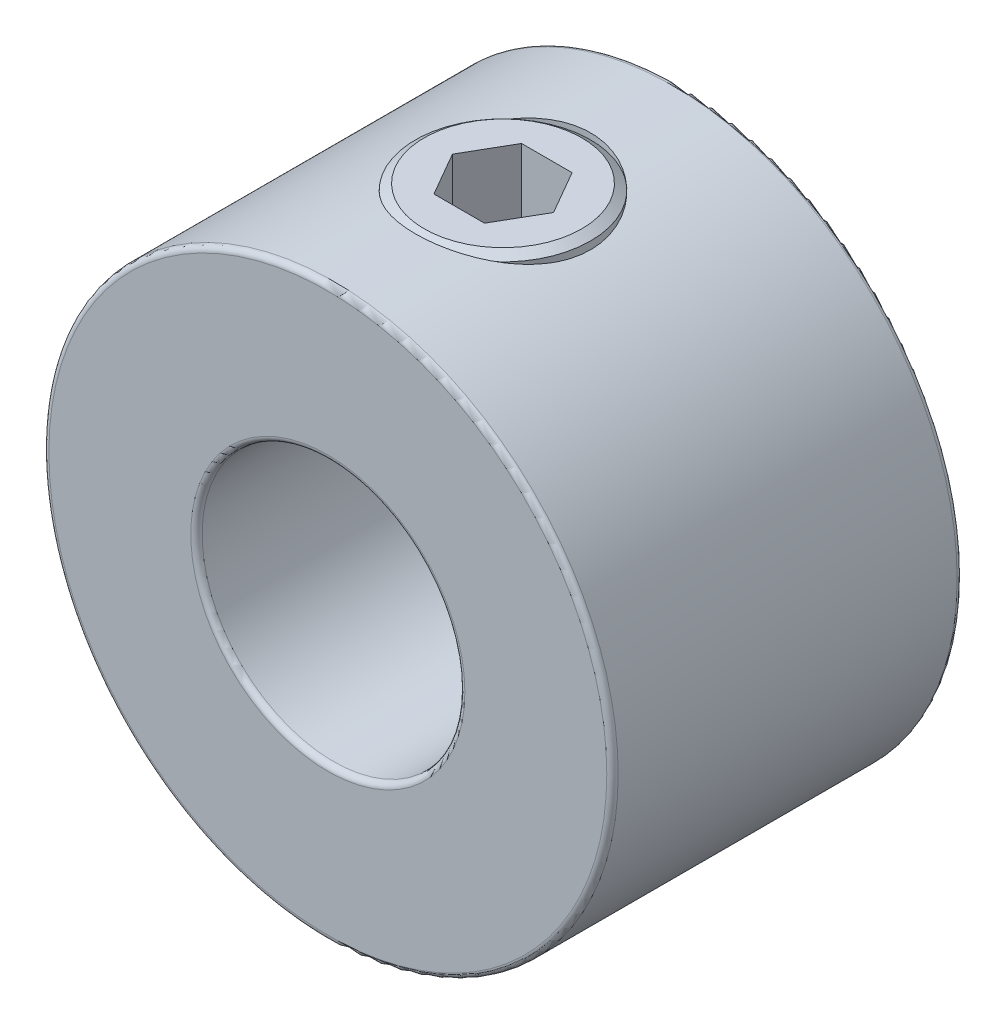
ISO-10303-21;
HEADER;
FILE_DESCRIPTION(('STEP AP214'),'2;1');
FILE_NAME('part.step','',(''),(''),'','','');
FILE_SCHEMA(('AUTOMOTIVE_DESIGN { 1 0 10303 214 1 1 1 1 }'));
ENDSEC;
DATA;
#1=APPLICATION_CONTEXT('core data for automotive mechanical design processes');
#2=APPLICATION_PROTOCOL_DEFINITION('international standard','automotive_design',2000,#1);
#3=PRODUCT_CONTEXT('',#1,'mechanical');
#4=PRODUCT('Part','Part','',(#3));
#5=PRODUCT_RELATED_PRODUCT_CATEGORY('part','',(#4));
#6=PRODUCT_DEFINITION_FORMATION('','',#4);
#7=PRODUCT_DEFINITION_CONTEXT('part definition',#1,'design');
#8=PRODUCT_DEFINITION('design','',#6,#7);
#9=PRODUCT_DEFINITION_SHAPE('','',#8);
#10=(LENGTH_UNIT() NAMED_UNIT(*) SI_UNIT(.MILLI.,.METRE.));
#11=(NAMED_UNIT(*) PLANE_ANGLE_UNIT() SI_UNIT($,.RADIAN.));
#12=(NAMED_UNIT(*) SI_UNIT($,.STERADIAN.) SOLID_ANGLE_UNIT());
#13=UNCERTAINTY_MEASURE_WITH_UNIT(LENGTH_MEASURE(1.E-05),#10,'distance_accuracy_value','');
#14=(GEOMETRIC_REPRESENTATION_CONTEXT(3) GLOBAL_UNCERTAINTY_ASSIGNED_CONTEXT((#13)) GLOBAL_UNIT_ASSIGNED_CONTEXT((#10,
#11,#12)) REPRESENTATION_CONTEXT('',''));
#15=CARTESIAN_POINT('',(0.,0.,0.));
#16=DIRECTION('',(0.,0.,1.));
#17=DIRECTION('',(1.,0.,0.));
#18=AXIS2_PLACEMENT_3D('',#15,#16,#17);
#19=CARTESIAN_POINT('',(0.,3.40407018740962,4.));
#20=DIRECTION('',(0.,1.,0.));
#21=DIRECTION('',(-1.,0.,0.));
#22=AXIS2_PLACEMENT_3D('',#19,#20,#21);
#23=CONICAL_SURFACE('',#22,2.,0.785398163397449);
#24=CARTESIAN_POINT('',(0.,2.5,4.));
#25=DIRECTION('',(0.,-1.,0.));
#26=DIRECTION('',(1.,0.,0.));
#27=AXIS2_PLACEMENT_3D('',#24,#25,#26);
#28=CIRCLE('',#27,1.09592981259038);
#29=CARTESIAN_POINT('',(1.09592981259038,2.5,4.));
#30=VERTEX_POINT('',#29);
#31=EDGE_CURVE('E12',#30,#30,#28,.T.);
#32=ORIENTED_EDGE('',*,*,#31,.F.);
#33=EDGE_LOOP('',(#32));
#34=FACE_BOUND('',#33,.T.);
#35=CARTESIAN_POINT('',(0.,3.40407018740962,4.));
#36=DIRECTION('',(0.,-1.,0.));
#37=DIRECTION('',(1.,0.,0.));
#38=AXIS2_PLACEMENT_3D('',#35,#36,#37);
#39=CIRCLE('',#38,2.);
#40=CARTESIAN_POINT('',(2.,3.40407018740962,4.));
#41=VERTEX_POINT('',#40);
#42=EDGE_CURVE('E145',#41,#41,#39,.T.);
#43=ORIENTED_EDGE('',*,*,#42,.T.);
#44=EDGE_LOOP('',(#43));
#45=FACE_BOUND('',#44,.T.);
#46=ADVANCED_FACE('F46',(#34,#45),#23,.T.);
#47=CARTESIAN_POINT('',(0.,2.5,4.));
#48=DIRECTION('',(0.,-1.,0.));
#49=DIRECTION('',(1.,0.,0.));
#50=AXIS2_PLACEMENT_3D('',#47,#48,#49);
#51=CONICAL_SURFACE('',#50,1.09592981259038,1.02974425867666);
#52=CARTESIAN_POINT('',(0.,3.15850106560381,4.));
#53=VERTEX_POINT('',#52);
#54=VERTEX_LOOP('',#53);
#55=FACE_BOUND('',#54,.T.);
#56=ORIENTED_EDGE('',*,*,#31,.T.);
#57=EDGE_LOOP('',(#56));
#58=FACE_BOUND('',#57,.T.);
#59=ADVANCED_FACE('F164',(#55,#58),#51,.F.);
#60=CARTESIAN_POINT('',(0.,6.5,4.));
#61=DIRECTION('',(0.,-1.,0.));
#62=DIRECTION('',(1.,0.,0.));
#63=AXIS2_PLACEMENT_3D('',#60,#61,#62);
#64=PLANE('',#63);
#65=DIRECTION('',(0.5,0.,0.866025403784439));
#66=VECTOR('',#65,1.);
#67=CARTESIAN_POINT('',(-1.15470053837925,6.5,4.));
#68=LINE('',#67,#66);
#69=CARTESIAN_POINT('',(-1.15470053837925,6.5,4.));
#70=VERTEX_POINT('',#69);
#71=CARTESIAN_POINT('',(-0.577350269189626,6.5,5.));
#72=VERTEX_POINT('',#71);
#73=EDGE_CURVE('E133',#70,#72,#68,.T.);
#74=ORIENTED_EDGE('',*,*,#73,.F.);
#75=DIRECTION('',(-0.5,0.,0.866025403784439));
#76=VECTOR('',#75,1.);
#77=CARTESIAN_POINT('',(-0.577350269189629,6.5,3.));
#78=LINE('',#77,#76);
#79=CARTESIAN_POINT('',(-0.577350269189629,6.5,3.));
#80=VERTEX_POINT('',#79);
#81=EDGE_CURVE('E60',#80,#70,#78,.T.);
#82=ORIENTED_EDGE('',*,*,#81,.F.);
#83=DIRECTION('',(-1.,0.,0.));
#84=VECTOR('',#83,1.);
#85=CARTESIAN_POINT('',(0.577350269189625,6.5,3.));
#86=LINE('',#85,#84);
#87=CARTESIAN_POINT('',(0.577350269189625,6.5,3.));
#88=VERTEX_POINT('',#87);
#89=EDGE_CURVE('E119',#88,#80,#86,.T.);
#90=ORIENTED_EDGE('',*,*,#89,.F.);
#91=DIRECTION('',(-0.5,0.,-0.866025403784439));
#92=VECTOR('',#91,1.);
#93=CARTESIAN_POINT('',(1.15470053837925,6.5,4.));
#94=LINE('',#93,#92);
#95=CARTESIAN_POINT('',(1.15470053837925,6.5,4.));
#96=VERTEX_POINT('',#95);
#97=EDGE_CURVE('E122',#96,#88,#94,.T.);
#98=ORIENTED_EDGE('',*,*,#97,.F.);
#99=DIRECTION('',(0.5,0.,-0.866025403784439));
#100=VECTOR('',#99,1.);
#101=CARTESIAN_POINT('',(0.577350269189623,6.5,5.));
#102=LINE('',#101,#100);
#103=CARTESIAN_POINT('',(0.577350269189623,6.5,5.));
#104=VERTEX_POINT('',#103);
#105=EDGE_CURVE('E138',#104,#96,#102,.T.);
#106=ORIENTED_EDGE('',*,*,#105,.F.);
#107=DIRECTION('',(1.,0.,0.));
#108=VECTOR('',#107,1.);
#109=CARTESIAN_POINT('',(-0.577350269189626,6.5,5.));
#110=LINE('',#109,#108);
#111=EDGE_CURVE('E135',#72,#104,#110,.T.);
#112=ORIENTED_EDGE('',*,*,#111,.F.);
#113=EDGE_LOOP('',(#74,#82,#90,#98,#106,#112));
#114=FACE_BOUND('',#113,.T.);
#115=CARTESIAN_POINT('',(0.,6.5,4.));
#116=DIRECTION('',(0.,-1.,0.));
#117=DIRECTION('',(1.,0.,0.));
#118=AXIS2_PLACEMENT_3D('',#115,#116,#117);
#119=CIRCLE('',#118,1.8);
#120=CARTESIAN_POINT('',(1.8,6.5,4.));
#121=VERTEX_POINT('',#120);
#122=EDGE_CURVE('E53',#121,#121,#119,.T.);
#123=ORIENTED_EDGE('',*,*,#122,.F.);
#124=EDGE_LOOP('',(#123));
#125=FACE_BOUND('',#124,.T.);
#126=ADVANCED_FACE('F162',(#114,#125),#64,.F.);
#127=CARTESIAN_POINT('',(0.,6.5,4.));
#128=DIRECTION('',(0.,-1.,0.));
#129=DIRECTION('',(1.,0.,0.));
#130=AXIS2_PLACEMENT_3D('',#127,#128,#129);
#131=CONICAL_SURFACE('',#130,1.8,0.959931088596886);
#132=CARTESIAN_POINT('',(0.,6.35995849235806,4.));
#133=DIRECTION('',(0.,-1.,0.));
#134=DIRECTION('',(1.,0.,0.));
#135=AXIS2_PLACEMENT_3D('',#132,#133,#134);
#136=CIRCLE('',#135,2.);
#137=CARTESIAN_POINT('',(2.,6.35995849235806,4.));
#138=VERTEX_POINT('',#137);
#139=EDGE_CURVE('E155',#138,#138,#136,.T.);
#140=ORIENTED_EDGE('',*,*,#139,.F.);
#141=EDGE_LOOP('',(#140));
#142=FACE_BOUND('',#141,.T.);
#143=ORIENTED_EDGE('',*,*,#122,.T.);
#144=EDGE_LOOP('',(#143));
#145=FACE_BOUND('',#144,.T.);
#146=ADVANCED_FACE('F160',(#142,#145),#131,.T.);
#147=CARTESIAN_POINT('',(0.,3.15850106560381,4.));
#148=DIRECTION('',(0.,-1.,0.));
#149=DIRECTION('',(1.,0.,0.));
#150=AXIS2_PLACEMENT_3D('',#147,#148,#149);
#151=CYLINDRICAL_SURFACE('',#150,2.);
#152=ORIENTED_EDGE('',*,*,#42,.F.);
#153=EDGE_LOOP('',(#152));
#154=FACE_BOUND('',#153,.T.);
#155=ORIENTED_EDGE('',*,*,#139,.T.);
#156=EDGE_LOOP('',(#155));
#157=FACE_BOUND('',#156,.T.);
#158=ADVANCED_FACE('F171',(#154,#157),#151,.T.);
#159=CARTESIAN_POINT('',(-0.577350269189629,4.9,3.));
#160=DIRECTION('',(-0.866025403784439,0.,-0.5));
#161=DIRECTION('',(-0.5,0.,0.866025403784439));
#162=AXIS2_PLACEMENT_3D('',#159,#160,#161);
#163=PLANE('',#162);
#164=ORIENTED_EDGE('',*,*,#81,.T.);
#165=DIRECTION('',(0.,1.,0.));
#166=VECTOR('',#165,1.);
#167=CARTESIAN_POINT('',(-1.15470053837925,4.9,4.));
#168=LINE('',#167,#166);
#169=CARTESIAN_POINT('',(-1.15470053837925,4.9,4.));
#170=VERTEX_POINT('',#169);
#171=EDGE_CURVE('E96',#170,#70,#168,.T.);
#172=ORIENTED_EDGE('',*,*,#171,.F.);
#173=DIRECTION('',(-0.5,0.,0.866025403784439));
#174=VECTOR('',#173,1.);
#175=CARTESIAN_POINT('',(-0.577350269189629,4.9,3.));
#176=LINE('',#175,#174);
#177=CARTESIAN_POINT('',(-0.577350269189629,4.9,3.));
#178=VERTEX_POINT('',#177);
#179=EDGE_CURVE('E100',#178,#170,#176,.T.);
#180=ORIENTED_EDGE('',*,*,#179,.F.);
#181=DIRECTION('',(0.,1.,0.));
#182=VECTOR('',#181,1.);
#183=CARTESIAN_POINT('',(-0.577350269189629,4.9,3.));
#184=LINE('',#183,#182);
#185=EDGE_CURVE('E143',#178,#80,#184,.T.);
#186=ORIENTED_EDGE('',*,*,#185,.T.);
#187=EDGE_LOOP('',(#164,#172,#180,#186));
#188=FACE_BOUND('',#187,.T.);
#189=ADVANCED_FACE('F98',(#188),#163,.F.);
#190=CARTESIAN_POINT('',(0.577350269189625,4.9,3.));
#191=DIRECTION('',(0.,0.,-1.));
#192=DIRECTION('',(-1.,0.,0.));
#193=AXIS2_PLACEMENT_3D('',#190,#191,#192);
#194=PLANE('',#193);
#195=ORIENTED_EDGE('',*,*,#89,.T.);
#196=ORIENTED_EDGE('',*,*,#185,.F.);
#197=DIRECTION('',(-1.,0.,0.));
#198=VECTOR('',#197,1.);
#199=CARTESIAN_POINT('',(0.577350269189625,4.9,3.));
#200=LINE('',#199,#198);
#201=CARTESIAN_POINT('',(0.577350269189625,4.9,3.));
#202=VERTEX_POINT('',#201);
#203=EDGE_CURVE('E106',#202,#178,#200,.T.);
#204=ORIENTED_EDGE('',*,*,#203,.F.);
#205=DIRECTION('',(0.,1.,0.));
#206=VECTOR('',#205,1.);
#207=CARTESIAN_POINT('',(0.577350269189625,4.9,3.));
#208=LINE('',#207,#206);
#209=EDGE_CURVE('E146',#202,#88,#208,.T.);
#210=ORIENTED_EDGE('',*,*,#209,.T.);
#211=EDGE_LOOP('',(#195,#196,#204,#210));
#212=FACE_BOUND('',#211,.T.);
#213=ADVANCED_FACE('F189',(#212),#194,.F.);
#214=CARTESIAN_POINT('',(1.15470053837925,4.9,4.));
#215=DIRECTION('',(0.866025403784438,0.,-0.5));
#216=DIRECTION('',(-0.5,0.,-0.866025403784439));
#217=AXIS2_PLACEMENT_3D('',#214,#215,#216);
#218=PLANE('',#217);
#219=ORIENTED_EDGE('',*,*,#97,.T.);
#220=ORIENTED_EDGE('',*,*,#209,.F.);
#221=DIRECTION('',(-0.5,0.,-0.866025403784439));
#222=VECTOR('',#221,1.);
#223=CARTESIAN_POINT('',(1.15470053837925,4.9,4.));
#224=LINE('',#223,#222);
#225=CARTESIAN_POINT('',(1.15470053837925,4.9,4.));
#226=VERTEX_POINT('',#225);
#227=EDGE_CURVE('E129',#226,#202,#224,.T.);
#228=ORIENTED_EDGE('',*,*,#227,.F.);
#229=DIRECTION('',(0.,1.,0.));
#230=VECTOR('',#229,1.);
#231=CARTESIAN_POINT('',(1.15470053837925,4.9,4.));
#232=LINE('',#231,#230);
#233=EDGE_CURVE('E148',#226,#96,#232,.T.);
#234=ORIENTED_EDGE('',*,*,#233,.T.);
#235=EDGE_LOOP('',(#219,#220,#228,#234));
#236=FACE_BOUND('',#235,.T.);
#237=ADVANCED_FACE('F201',(#236),#218,.F.);
#238=CARTESIAN_POINT('',(0.577350269189623,4.9,5.));
#239=DIRECTION('',(0.866025403784439,0.,0.5));
#240=DIRECTION('',(0.5,0.,-0.866025403784439));
#241=AXIS2_PLACEMENT_3D('',#238,#239,#240);
#242=PLANE('',#241);
#243=ORIENTED_EDGE('',*,*,#105,.T.);
#244=ORIENTED_EDGE('',*,*,#233,.F.);
#245=DIRECTION('',(0.5,0.,-0.866025403784439));
#246=VECTOR('',#245,1.);
#247=CARTESIAN_POINT('',(0.577350269189623,4.9,5.));
#248=LINE('',#247,#246);
#249=CARTESIAN_POINT('',(0.577350269189623,4.9,5.));
#250=VERTEX_POINT('',#249);
#251=EDGE_CURVE('E126',#250,#226,#248,.T.);
#252=ORIENTED_EDGE('',*,*,#251,.F.);
#253=DIRECTION('',(0.,1.,0.));
#254=VECTOR('',#253,1.);
#255=CARTESIAN_POINT('',(0.577350269189623,4.9,5.));
#256=LINE('',#255,#254);
#257=EDGE_CURVE('E150',#250,#104,#256,.T.);
#258=ORIENTED_EDGE('',*,*,#257,.T.);
#259=EDGE_LOOP('',(#243,#244,#252,#258));
#260=FACE_BOUND('',#259,.T.);
#261=ADVANCED_FACE('F197',(#260),#242,.F.);
#262=CARTESIAN_POINT('',(-0.577350269189626,4.9,5.));
#263=DIRECTION('',(0.,0.,1.));
#264=DIRECTION('',(1.,0.,0.));
#265=AXIS2_PLACEMENT_3D('',#262,#263,#264);
#266=PLANE('',#265);
#267=ORIENTED_EDGE('',*,*,#111,.T.);
#268=ORIENTED_EDGE('',*,*,#257,.F.);
#269=DIRECTION('',(1.,0.,0.));
#270=VECTOR('',#269,1.);
#271=CARTESIAN_POINT('',(-0.577350269189626,4.9,5.));
#272=LINE('',#271,#270);
#273=CARTESIAN_POINT('',(-0.577350269189626,4.9,5.));
#274=VERTEX_POINT('',#273);
#275=EDGE_CURVE('E114',#274,#250,#272,.T.);
#276=ORIENTED_EDGE('',*,*,#275,.F.);
#277=DIRECTION('',(0.,1.,0.));
#278=VECTOR('',#277,1.);
#279=CARTESIAN_POINT('',(-0.577350269189626,4.9,5.));
#280=LINE('',#279,#278);
#281=EDGE_CURVE('E105',#274,#72,#280,.T.);
#282=ORIENTED_EDGE('',*,*,#281,.T.);
#283=EDGE_LOOP('',(#267,#268,#276,#282));
#284=FACE_BOUND('',#283,.T.);
#285=ADVANCED_FACE('F194',(#284),#266,.F.);
#286=CARTESIAN_POINT('',(-1.15470053837925,4.9,4.));
#287=DIRECTION('',(-0.866025403784438,0.,0.5));
#288=DIRECTION('',(0.5,0.,0.866025403784439));
#289=AXIS2_PLACEMENT_3D('',#286,#287,#288);
#290=PLANE('',#289);
#291=ORIENTED_EDGE('',*,*,#73,.T.);
#292=ORIENTED_EDGE('',*,*,#281,.F.);
#293=DIRECTION('',(0.5,0.,0.866025403784439));
#294=VECTOR('',#293,1.);
#295=CARTESIAN_POINT('',(-1.15470053837925,4.9,4.));
#296=LINE('',#295,#294);
#297=EDGE_CURVE('E109',#170,#274,#296,.T.);
#298=ORIENTED_EDGE('',*,*,#297,.F.);
#299=ORIENTED_EDGE('',*,*,#171,.T.);
#300=EDGE_LOOP('',(#291,#292,#298,#299));
#301=FACE_BOUND('',#300,.T.);
#302=ADVANCED_FACE('F110',(#301),#290,.F.);
#303=CARTESIAN_POINT('',(-1.73205080756888,4.9,5.));
#304=DIRECTION('',(0.,1.,0.));
#305=DIRECTION('',(0.,0.,1.));
#306=AXIS2_PLACEMENT_3D('',#303,#304,#305);
#307=PLANE('',#306);
#308=ORIENTED_EDGE('',*,*,#179,.T.);
#309=ORIENTED_EDGE('',*,*,#297,.T.);
#310=ORIENTED_EDGE('',*,*,#275,.T.);
#311=ORIENTED_EDGE('',*,*,#251,.T.);
#312=ORIENTED_EDGE('',*,*,#227,.T.);
#313=ORIENTED_EDGE('',*,*,#203,.T.);
#314=EDGE_LOOP('',(#308,#309,#310,#311,#312,#313));
#315=FACE_BOUND('',#314,.T.);
#316=ADVANCED_FACE('F116',(#315),#307,.T.);
#317=CLOSED_SHELL('',(#46,#59,#126,#146,#158,#189,#213,#237,#261,#285,#302,#316));
#318=MANIFOLD_SOLID_BREP('B2',#317);
#319=CARTESIAN_POINT('',(0.,0.,8.));
#320=DIRECTION('',(0.,0.,1.));
#321=DIRECTION('',(1.,0.,0.));
#322=AXIS2_PLACEMENT_3D('',#319,#320,#321);
#323=PLANE('',#322);
#324=CARTESIAN_POINT('',(0.,0.,8.));
#325=DIRECTION('',(0.,0.,1.));
#326=DIRECTION('',(1.,0.,0.));
#327=AXIS2_PLACEMENT_3D('',#324,#325,#326);
#328=CIRCLE('',#327,3.13);
#329=CARTESIAN_POINT('',(3.13,0.,8.));
#330=VERTEX_POINT('',#329);
#331=EDGE_CURVE('E320',#330,#330,#328,.F.);
#332=ORIENTED_EDGE('',*,*,#331,.T.);
#333=EDGE_LOOP('',(#332));
#334=FACE_BOUND('',#333,.T.);
#335=CARTESIAN_POINT('',(0.,0.,8.));
#336=DIRECTION('',(0.,0.,1.));
#337=DIRECTION('',(1.,0.,0.));
#338=AXIS2_PLACEMENT_3D('',#335,#336,#337);
#339=CIRCLE('',#338,6.37);
#340=CARTESIAN_POINT('',(6.37,0.,8.));
#341=VERTEX_POINT('',#340);
#342=EDGE_CURVE('E324',#341,#341,#339,.T.);
#343=ORIENTED_EDGE('',*,*,#342,.T.);
#344=EDGE_LOOP('',(#343));
#345=FACE_BOUND('',#344,.T.);
#346=ADVANCED_FACE('F309',(#334,#345),#323,.T.);
#347=CARTESIAN_POINT('',(0.,0.,0.));
#348=DIRECTION('',(0.,0.,1.));
#349=DIRECTION('',(1.,0.,0.));
#350=AXIS2_PLACEMENT_3D('',#347,#348,#349);
#351=PLANE('',#350);
#352=CARTESIAN_POINT('',(0.,0.,0.));
#353=DIRECTION('',(0.,0.,1.));
#354=DIRECTION('',(1.,0.,0.));
#355=AXIS2_PLACEMENT_3D('',#352,#353,#354);
#356=CIRCLE('',#355,3.13);
#357=CARTESIAN_POINT('',(3.13,0.,0.));
#358=VERTEX_POINT('',#357);
#359=EDGE_CURVE('E335',#358,#358,#356,.T.);
#360=ORIENTED_EDGE('',*,*,#359,.T.);
#361=EDGE_LOOP('',(#360));
#362=FACE_BOUND('',#361,.T.);
#363=CARTESIAN_POINT('',(0.,0.,0.));
#364=DIRECTION('',(0.,0.,1.));
#365=DIRECTION('',(1.,0.,0.));
#366=AXIS2_PLACEMENT_3D('',#363,#364,#365);
#367=CIRCLE('',#366,6.37);
#368=CARTESIAN_POINT('',(6.37,0.,0.));
#369=VERTEX_POINT('',#368);
#370=EDGE_CURVE('E338',#369,#369,#367,.F.);
#371=ORIENTED_EDGE('',*,*,#370,.T.);
#372=EDGE_LOOP('',(#371));
#373=FACE_BOUND('',#372,.T.);
#374=ADVANCED_FACE('F374',(#362,#373),#351,.F.);
#375=CARTESIAN_POINT('',(0.,0.,8.));
#376=DIRECTION('',(0.,0.,-1.));
#377=DIRECTION('',(-1.,0.,0.));
#378=AXIS2_PLACEMENT_3D('',#375,#376,#377);
#379=CYLINDRICAL_SURFACE('',#378,6.5);
#380=CARTESIAN_POINT('',(0.,0.,0.13));
#381=DIRECTION('',(0.,0.,1.));
#382=DIRECTION('',(1.,0.,0.));
#383=AXIS2_PLACEMENT_3D('',#380,#381,#382);
#384=CIRCLE('',#383,6.5);
#385=CARTESIAN_POINT('',(6.5,0.,0.13));
#386=VERTEX_POINT('',#385);
#387=EDGE_CURVE('E45',#386,#386,#384,.T.);
#388=ORIENTED_EDGE('',*,*,#387,.T.);
#389=EDGE_LOOP('',(#388));
#390=FACE_BOUND('',#389,.T.);
#391=CARTESIAN_POINT('',(0.,0.,7.87));
#392=DIRECTION('',(0.,0.,1.));
#393=DIRECTION('',(1.,0.,0.));
#394=AXIS2_PLACEMENT_3D('',#391,#392,#393);
#395=CIRCLE('',#394,6.5);
#396=CARTESIAN_POINT('',(6.5,0.,7.87));
#397=VERTEX_POINT('',#396);
#398=EDGE_CURVE('E316',#397,#397,#395,.F.);
#399=ORIENTED_EDGE('',*,*,#398,.T.);
#400=EDGE_LOOP('',(#399));
#401=FACE_BOUND('',#400,.T.);
#402=CARTESIAN_POINT('',(0.,6.5,6.));
#403=CARTESIAN_POINT('',(-0.10958647155408,6.49999929187436,5.99999903907904));
#404=CARTESIAN_POINT('',(-0.219182761349475,6.49720235792931,5.99096335239673));
#405=CARTESIAN_POINT('',(-0.435175528984373,6.48631855265072,5.95515058806477));
#406=CARTESIAN_POINT('',(-0.541571186300281,6.47823033671536,5.92836900086749));
#407=CARTESIAN_POINT('',(-0.748016546984701,6.45764858487676,5.85804929310721));
#408=CARTESIAN_POINT('',(-0.848075627090343,6.44516174661238,5.81453663922322));
#409=CARTESIAN_POINT('',(-1.03947745536718,6.41707535917941,5.71209679263276));
#410=CARTESIAN_POINT('',(-1.13081890919355,6.40147534884382,5.65316731576617));
#411=CARTESIAN_POINT('',(-1.30493699247679,6.36829752406617,5.51970232456005));
#412=CARTESIAN_POINT('',(-1.38741488565838,6.35067760587488,5.44478758075688));
#413=CARTESIAN_POINT('',(-1.53885708269872,6.31569252815342,5.28228637649204));
#414=CARTESIAN_POINT('',(-1.60781896662595,6.29832741475793,5.19469765172807));
#415=CARTESIAN_POINT('',(-1.73187276184925,6.26536877845659,5.00677139557264));
#416=CARTESIAN_POINT('',(-1.78659481361997,6.24982736044083,4.90617971070223));
#417=CARTESIAN_POINT('',(-1.8782224418158,6.22290748386974,4.69666603626275));
#418=CARTESIAN_POINT('',(-1.91513254914664,6.21152796681115,4.58774617334561));
#419=CARTESIAN_POINT('',(-1.96900160513188,6.19466009001291,4.36803269394755));
#420=CARTESIAN_POINT('',(-1.9865133955599,6.18900890037713,4.25738746639271));
#421=CARTESIAN_POINT('',(-2.00281555895419,6.1837537050085,4.03459625942759));
#422=CARTESIAN_POINT('',(-2.00161073572821,6.18414814760279,3.92245067248251));
#423=CARTESIAN_POINT('',(-1.98094698228321,6.19079569362891,3.7043849294011));
#424=CARTESIAN_POINT('',(-1.96218684702854,6.19682450731137,3.59839057467778));
#425=CARTESIAN_POINT('',(-1.90807645250928,6.21369772255051,3.39113330340309));
#426=CARTESIAN_POINT('',(-1.87272447914839,6.22454262164885,3.28987087689416));
#427=CARTESIAN_POINT('',(-1.785932217008,6.2500007072195,3.09326995215499));
#428=CARTESIAN_POINT('',(-1.73426970827151,6.2646654217354,2.99803651437156));
#429=CARTESIAN_POINT('',(-1.61647725848254,6.29608673576222,2.81735945562831));
#430=CARTESIAN_POINT('',(-1.55034365635742,6.31284386417593,2.73191832039407));
#431=CARTESIAN_POINT('',(-1.40204114131455,6.34746551983527,2.56929561166795));
#432=CARTESIAN_POINT('',(-1.31929416295853,6.36534631113152,2.49264371743337));
#433=CARTESIAN_POINT('',(-1.14189770882472,6.39954830533241,2.35417779565687));
#434=CARTESIAN_POINT('',(-1.04724740490765,6.4158693995865,2.2923648013595));
#435=CARTESIAN_POINT('',(-0.847732923697559,6.44527556867774,2.1849870228725));
#436=CARTESIAN_POINT('',(-0.74279871896691,6.45833594999018,2.13954513596117));
#437=CARTESIAN_POINT('',(-0.526280934909784,6.47957102319473,2.06711374604147));
#438=CARTESIAN_POINT('',(-0.414699321015768,6.48774715140185,2.04011881798934));
#439=CARTESIAN_POINT('',(-0.192552832432245,6.49806290071844,2.00624195342491));
#440=CARTESIAN_POINT('',(-0.0821071867281258,6.50041772114304,1.9986426474343));
#441=CARTESIAN_POINT('',(0.138491178007731,6.49946000316609,2.00175476648801));
#442=CARTESIAN_POINT('',(0.248643936188296,6.49614826472317,2.01246360693707));
#443=CARTESIAN_POINT('',(0.462785801451478,6.48437074848215,2.05131048211023));
#444=CARTESIAN_POINT('',(0.566859358780054,6.47603039774079,2.07902464716615));
#445=CARTESIAN_POINT('',(0.76885281136936,6.45516726536364,2.1505810764271));
#446=CARTESIAN_POINT('',(0.866771952253667,6.44264397218779,2.19442531327608));
#447=CARTESIAN_POINT('',(1.05627961444668,6.41433382910965,2.29817119480995));
#448=CARTESIAN_POINT('',(1.14766081519562,6.39847611273321,2.35843167676517));
#449=CARTESIAN_POINT('',(1.31925606832412,6.36531333623025,2.49286683008083));
#450=CARTESIAN_POINT('',(1.39946717074091,6.34800789569184,2.56704516497603));
#451=CARTESIAN_POINT('',(1.54963528009096,6.31306645909658,2.73058329944897));
#452=CARTESIAN_POINT('',(1.61908131008095,6.29544322340724,2.82041607594927));
#453=CARTESIAN_POINT('',(1.74195487773042,6.2625596331719,3.01084333460187));
#454=CARTESIAN_POINT('',(1.79538273895787,6.24729923089954,3.11143759931574));
#455=CARTESIAN_POINT('',(1.88435707765313,6.22104126828921,3.32027825692903));
#456=CARTESIAN_POINT('',(1.91997867102389,6.21002584634022,3.42849026977304));
#457=CARTESIAN_POINT('',(1.97237526121825,6.19358575896332,3.64978261572606));
#458=CARTESIAN_POINT('',(1.98915714872108,6.18815904950702,3.76286115316602));
#459=CARTESIAN_POINT('',(2.00291323790433,6.18371932373484,3.98534807210792));
#460=CARTESIAN_POINT('',(2.00072360720728,6.18443554393433,4.09470000455106));
#461=CARTESIAN_POINT('',(1.97860856561739,6.19154584982148,4.31139783884726));
#462=CARTESIAN_POINT('',(1.95868393542585,6.19793968557834,4.41874382879029));
#463=CARTESIAN_POINT('',(1.90221657867545,6.21549850608435,4.6269374285375));
#464=CARTESIAN_POINT('',(1.8659061649831,6.22659666514378,4.72785410568484));
#465=CARTESIAN_POINT('',(1.77788001247773,6.2522984100404,4.92224355662551));
#466=CARTESIAN_POINT('',(1.72616121006624,6.26690269287625,5.01571484538876));
#467=CARTESIAN_POINT('',(1.60648172875982,6.29866516433667,5.19641250748051));
#468=CARTESIAN_POINT('',(1.5379775201733,6.31589943241281,5.28326549413256));
#469=CARTESIAN_POINT('',(1.38763671757875,6.35062263668654,5.44451406697947));
#470=CARTESIAN_POINT('',(1.30579660000223,6.36811163907406,5.51890635028652));
#471=CARTESIAN_POINT('',(1.12802317077526,6.40203042414331,5.65544917959683));
#472=CARTESIAN_POINT('',(1.03172886568531,6.41840990638034,5.71714357533484));
#473=CARTESIAN_POINT('',(0.8296311920098,6.44764383058531,5.82338445665249));
#474=CARTESIAN_POINT('',(0.723831864032403,6.4604997610969,5.86793818662102));
#475=CARTESIAN_POINT('',(0.51592965257142,6.48025348346413,5.93510071206019));
#476=CARTESIAN_POINT('',(0.414403258515528,6.48759534805451,5.95936947108914));
#477=CARTESIAN_POINT('',(0.208587191828519,6.49746849091069,5.99181805932323));
#478=CARTESIAN_POINT('',(0.104298042658335,6.50000067395288,6.00000091454879));
#479=CARTESIAN_POINT('',(0.,6.5,6.));
#480=B_SPLINE_CURVE_WITH_KNOTS('',3,(#402,#403,#404,#405,#406,#407,#408,#409,#410,#411,#412,
#413,#414,#415,#416,#417,#418,#419,#420,#421,#422,#423,#424,#425,#426,#427,#428,#429,#430,#431,
#432,#433,#434,#435,#436,#437,#438,#439,#440,#441,#442,#443,#444,#445,#446,#447,#448,#449,#450,
#451,#452,#453,#454,#455,#456,#457,#458,#459,#460,#461,#462,#463,#464,#465,#466,#467,#468,#469,
#470,#471,#472,#473,#474,#475,#476,#477,#478,#479),.UNSPECIFIED.,.T.,.F.,(4,2,2,2,2,2,2,2,2,2,2,
2,2,2,2,2,2,2,2,2,2,2,2,2,2,2,2,2,2,2,2,2,2,2,2,2,2,2,4),(0.,0.328376148353204,
0.656835774920463,0.984797413319644,1.31280767013794,1.64969601962051,1.98664463123191,
2.33162619975385,2.67651996741947,3.0113091274622,3.34601236190892,3.66793485951994,
3.98989062214146,4.3164372458817,4.64306657905952,4.98408507994296,5.32512731933627,
5.66867887562647,6.01212935372403,6.34267966649236,6.67318331870836,6.99576592200041,
7.31838798898982,7.6487232534981,7.97914559299321,8.32223487802099,8.6653172321574,
9.00693981167224,9.34843740094786,9.67496275718919,10.0014737403731,10.3234943027839,
10.6455789342452,10.9799294848454,11.3143685200785,11.6592775258489,12.0040405975475,
12.3166287634493,12.6291581207982),.UNSPECIFIED.);
#481=CARTESIAN_POINT('',(0.,6.5,6.));
#482=VERTEX_POINT('',#481);
#483=EDGE_CURVE('E341',#482,#482,#480,.T.);
#484=ORIENTED_EDGE('',*,*,#483,.T.);
#485=EDGE_LOOP('',(#484));
#486=FACE_BOUND('',#485,.T.);
#487=ADVANCED_FACE('F370',(#390,#401,#486),#379,.T.);
#488=CARTESIAN_POINT('',(0.,0.,8.));
#489=DIRECTION('',(0.,0.,-1.));
#490=DIRECTION('',(-1.,0.,0.));
#491=AXIS2_PLACEMENT_3D('',#488,#489,#490);
#492=CYLINDRICAL_SURFACE('',#491,3.);
#493=CARTESIAN_POINT('',(0.,0.,0.13));
#494=DIRECTION('',(0.,0.,1.));
#495=DIRECTION('',(1.,0.,0.));
#496=AXIS2_PLACEMENT_3D('',#493,#494,#495);
#497=CIRCLE('',#496,3.);
#498=CARTESIAN_POINT('',(3.,0.,0.13));
#499=VERTEX_POINT('',#498);
#500=EDGE_CURVE('E329',#499,#499,#497,.F.);
#501=ORIENTED_EDGE('',*,*,#500,.T.);
#502=EDGE_LOOP('',(#501));
#503=FACE_BOUND('',#502,.T.);
#504=CARTESIAN_POINT('',(0.,0.,7.87));
#505=DIRECTION('',(0.,0.,1.));
#506=DIRECTION('',(1.,0.,0.));
#507=AXIS2_PLACEMENT_3D('',#504,#505,#506);
#508=CIRCLE('',#507,3.);
#509=CARTESIAN_POINT('',(3.,0.,7.87));
#510=VERTEX_POINT('',#509);
#511=EDGE_CURVE('E332',#510,#510,#508,.T.);
#512=ORIENTED_EDGE('',*,*,#511,.T.);
#513=EDGE_LOOP('',(#512));
#514=FACE_BOUND('',#513,.T.);
#515=CARTESIAN_POINT('',(0.,3.,6.));
#516=CARTESIAN_POINT('',(-0.100484716668078,3.0000004164484,6.00000054963247));
#517=CARTESIAN_POINT('',(-0.200969087132901,2.99490802753388,5.9923860300445));
#518=CARTESIAN_POINT('',(-0.398733058031681,2.97504652423808,5.96240313589434));
#519=CARTESIAN_POINT('',(-0.496011113955007,2.96027281581235,5.94002775687671));
#520=CARTESIAN_POINT('',(-0.684212307854249,2.92250482404708,5.88189228267516));
#521=CARTESIAN_POINT('',(-0.775162872657554,2.89954905493315,5.84619485999206));
#522=CARTESIAN_POINT('',(-0.949415290997259,2.8472613787744,5.7629366367285));
#523=CARTESIAN_POINT('',(-1.03271603160967,2.8179285460551,5.71537411369944));
#524=CARTESIAN_POINT('',(-1.19728470077011,2.75227329369838,5.60534306263257));
#525=CARTESIAN_POINT('',(-1.27778030546067,2.71556897579319,5.54195213925711));
#526=CARTESIAN_POINT('',(-1.42772804469274,2.63982313083466,5.40426995134155));
#527=CARTESIAN_POINT('',(-1.49716405543888,2.60077830356832,5.32996307016226));
#528=CARTESIAN_POINT('',(-1.63422297745496,2.51728264678794,5.15894763238732));
#529=CARTESIAN_POINT('',(-1.6998318636275,2.47295067937795,5.06055434679655));
#530=CARTESIAN_POINT('',(-1.81350357014175,2.3908414735282,4.85163662235347));
#531=CARTESIAN_POINT('',(-1.86159673426503,2.35305295954667,4.74113359843726));
#532=CARTESIAN_POINT('',(-1.92674035011438,2.2997626664146,4.54328870657837));
#533=CARTESIAN_POINT('',(-1.94874447236008,2.28097627892403,4.45847154712609));
#534=CARTESIAN_POINT('',(-1.98150617785228,2.25257969659604,4.28525549525835));
#535=CARTESIAN_POINT('',(-1.99228314651963,2.24295368744147,4.19686305127394));
#536=CARTESIAN_POINT('',(-2.00191364141227,2.23436605608045,4.01852522114353));
#537=CARTESIAN_POINT('',(-2.00071842917524,2.23544802558502,3.9285749765476));
#538=CARTESIAN_POINT('',(-1.98637581333356,2.24819775483425,3.75036502650025));
#539=CARTESIAN_POINT('',(-1.97321828380393,2.25987448286881,3.66210681797187));
#540=CARTESIAN_POINT('',(-1.93664994217326,2.29127185989959,3.49353294875812));
#541=CARTESIAN_POINT('',(-1.91371711479477,2.31061488324375,3.41303866406123));
#542=CARTESIAN_POINT('',(-1.85870118583424,2.35509622933623,3.25697630902422));
#543=CARTESIAN_POINT('',(-1.8266150732855,2.38023645854889,3.18140986976135));
#544=CARTESIAN_POINT('',(-1.74673818732648,2.43964196377947,3.02097460464356));
#545=CARTESIAN_POINT('',(-1.69708052300445,2.47472317740626,2.93734009951691));
#546=CARTESIAN_POINT('',(-1.58668960438221,2.54691537733438,2.77861660471425));
#547=CARTESIAN_POINT('',(-1.52594268999614,2.58402882709328,2.70353834223793));
#548=CARTESIAN_POINT('',(-1.37981165322309,2.66543343763724,2.54745745439658));
#549=CARTESIAN_POINT('',(-1.29193938283656,2.7095474472056,2.46866595131724));
#550=CARTESIAN_POINT('',(-1.10200799908008,2.79218100665211,2.32680350546152));
#551=CARTESIAN_POINT('',(-0.999962299343699,2.83070577648042,2.26371785459102));
#552=CARTESIAN_POINT('',(-0.804857827096533,2.89145404090364,2.16652228137713));
#553=CARTESIAN_POINT('',(-0.713957643371913,2.91539261165539,2.12915663666106));
#554=CARTESIAN_POINT('',(-0.526036043935484,2.95507719030498,2.06789507437463));
#555=CARTESIAN_POINT('',(-0.429019879001653,2.97083012127543,2.04398777286779));
#556=CARTESIAN_POINT('',(-0.230985453172284,2.99275882156808,2.010838834762));
#557=CARTESIAN_POINT('',(-0.129951811934161,2.99889322461186,2.00166053906174));
#558=CARTESIAN_POINT('',(0.0724415193893432,3.00083114965147,1.99875291143779));
#559=CARTESIAN_POINT('',(0.173801186186622,2.99663539385634,2.00502249951123));
#560=CARTESIAN_POINT('',(0.366455717204236,2.97899589424273,2.03162405556195));
#561=CARTESIAN_POINT('',(0.45795744467919,2.96622246390226,2.05093729775522));
#562=CARTESIAN_POINT('',(0.636116392427398,2.93318449284837,2.10159568601286));
#563=CARTESIAN_POINT('',(0.722772837571131,2.91291875746989,2.13294275092821));
#564=CARTESIAN_POINT('',(0.894664750465994,2.86496352529158,2.20865229704492));
#565=CARTESIAN_POINT('',(0.979496184631416,2.83689870135785,2.25368815408185));
#566=CARTESIAN_POINT('',(1.14068302395729,2.77601855611511,2.35443328994627));
#567=CARTESIAN_POINT('',(1.2170331482009,2.74320030403941,2.41014916053217));
#568=CARTESIAN_POINT('',(1.37185445482324,2.6695454665343,2.54060786815751));
#569=CARTESIAN_POINT('',(1.44875187569565,2.62826156800165,2.61696626007508));
#570=CARTESIAN_POINT('',(1.58933968069448,2.54571173085958,2.78111142995711));
#571=CARTESIAN_POINT('',(1.6530209365723,2.50444582417845,2.8689060391075));
#572=CARTESIAN_POINT('',(1.76124776549313,2.4293967897058,3.04714241276812));
#573=CARTESIAN_POINT('',(1.80695636125283,2.39527597025701,3.13673203346221));
#574=CARTESIAN_POINT('',(1.88496213740264,2.33438974266154,3.32387265244363));
#575=CARTESIAN_POINT('',(1.91728345682189,2.30761112529822,3.42140893830462));
#576=CARTESIAN_POINT('',(1.9623584346534,2.26933208182633,3.60456448719541));
#577=CARTESIAN_POINT('',(1.97758597566225,2.25594998021257,3.68917180987601));
#578=CARTESIAN_POINT('',(1.99699205923373,2.23879466438398,3.86057328131838));
#579=CARTESIAN_POINT('',(2.00118260285317,2.23501101347816,3.94736495113949));
#580=CARTESIAN_POINT('',(1.99823921981266,2.23764201149981,4.1206430567237));
#581=CARTESIAN_POINT('',(1.99109858767783,2.24406269907463,4.20712928137375));
#582=CARTESIAN_POINT('',(1.96596997224746,2.26610452403491,4.37734352853211));
#583=CARTESIAN_POINT('',(1.94796751728258,2.28173793527615,4.46106771382432));
#584=CARTESIAN_POINT('',(1.89593035657494,2.325268439048,4.64571118648123));
#585=CARTESIAN_POINT('',(1.85890187130765,2.35532333574982,4.74526771294332));
#586=CARTESIAN_POINT('',(1.77084526236221,2.42222161121309,4.93548683438421));
#587=CARTESIAN_POINT('',(1.71979748341259,2.45907449686699,5.02613669799169));
#588=CARTESIAN_POINT('',(1.60398280555153,2.53617186577119,5.19928188713623));
#589=CARTESIAN_POINT('',(1.53898309894021,2.5764658739228,5.28159874542305));
#590=CARTESIAN_POINT('',(1.39671768031095,2.65628301537844,5.43532247825793));
#591=CARTESIAN_POINT('',(1.31944821025749,2.69580590832396,5.50672599702921));
#592=CARTESIAN_POINT('',(1.14145732976974,2.77631551964082,5.64671210430908));
#593=CARTESIAN_POINT('',(1.03896166955575,2.81669805449991,5.71341864017832));
#594=CARTESIAN_POINT('',(0.820868555771218,2.88777665874161,5.8279132766653));
#595=CARTESIAN_POINT('',(0.705292062449158,2.91848793445255,5.87573110682395));
#596=CARTESIAN_POINT('',(0.491435069835747,2.96101644836895,5.94115457816378));
#597=CARTESIAN_POINT('',(0.395012325257923,2.97551480368934,5.96311103909862));
#598=CARTESIAN_POINT('',(0.199058012023947,2.99500280141853,5.9925280325381));
#599=CARTESIAN_POINT('',(0.0995288361880082,2.99999958751315,5.99999945559601));
#600=CARTESIAN_POINT('',(0.,3.,6.));
#601=B_SPLINE_CURVE_WITH_KNOTS('',3,(#515,#516,#517,#518,#519,#520,#521,#522,#523,#524,#525,
#526,#527,#528,#529,#530,#531,#532,#533,#534,#535,#536,#537,#538,#539,#540,#541,#542,#543,#544,
#545,#546,#547,#548,#549,#550,#551,#552,#553,#554,#555,#556,#557,#558,#559,#560,#561,#562,#563,
#564,#565,#566,#567,#568,#569,#570,#571,#572,#573,#574,#575,#576,#577,#578,#579,#580,#581,#582,
#583,#584,#585,#586,#587,#588,#589,#590,#591,#592,#593,#594,#595,#596,#597,#598,#599,#600),
.UNSPECIFIED.,.T.,.F.,(4,2,2,2,2,2,2,2,2,2,2,2,2,2,2,2,2,2,2,2,2,2,2,2,2,2,2,2,2,2,2,2,2,2,2,2,
2,2,2,2,2,2,4),(0.,0.3010532265054,0.602249414348688,0.902046153190231,1.20188643867386,
1.52717029000557,1.85292411604319,2.23006683295982,2.60655305445439,2.87433693676029,
3.14165767845809,3.41006711735378,3.67870397263352,3.93548862198022,4.19235783805078,
4.50147574660873,4.81097703780057,5.18718954496752,5.56304840301362,5.86524087696758,
6.16717735142813,6.4704088329425,6.77361911533414,7.05553084792472,7.3374875513827,
7.63652346829516,7.93574454945203,8.28228176141291,8.62905753175757,8.94649935304476,
9.26336626640723,9.52324048016135,9.78283200333091,10.0425772028455,10.302669238524,
10.6320660870419,10.9619271337795,11.2977924520448,11.6337608397015,12.0179535155883,
12.4015390656083,12.6999529136674,12.9981423125957),.UNSPECIFIED.);
#602=CARTESIAN_POINT('',(0.,3.,6.));
#603=VERTEX_POINT('',#602);
#604=EDGE_CURVE('E342',#603,#603,#601,.T.);
#605=ORIENTED_EDGE('',*,*,#604,.F.);
#606=EDGE_LOOP('',(#605));
#607=FACE_BOUND('',#606,.T.);
#608=ADVANCED_FACE('F354',(#503,#514,#607),#492,.F.);
#609=CARTESIAN_POINT('',(0.,-5.65685424949238,4.));
#610=DIRECTION('',(0.,1.,0.));
#611=DIRECTION('',(0.,0.,1.));
#612=AXIS2_PLACEMENT_3D('',#609,#610,#611);
#613=CYLINDRICAL_SURFACE('',#612,2.);
#614=ORIENTED_EDGE('',*,*,#604,.T.);
#615=EDGE_LOOP('',(#614));
#616=FACE_BOUND('',#615,.T.);
#617=ORIENTED_EDGE('',*,*,#483,.F.);
#618=EDGE_LOOP('',(#617));
#619=FACE_BOUND('',#618,.T.);
#620=ADVANCED_FACE('F357',(#616,#619),#613,.F.);
#621=CARTESIAN_POINT('',(0.,0.,0.13));
#622=DIRECTION('',(0.,0.,1.));
#623=DIRECTION('',(1.,0.,0.));
#624=AXIS2_PLACEMENT_3D('',#621,#622,#623);
#625=TOROIDAL_SURFACE('',#624,3.13,0.13);
#626=ORIENTED_EDGE('',*,*,#500,.F.);
#627=EDGE_LOOP('',(#626));
#628=FACE_BOUND('',#627,.T.);
#629=ORIENTED_EDGE('',*,*,#359,.F.);
#630=EDGE_LOOP('',(#629));
#631=FACE_BOUND('',#630,.T.);
#632=ADVANCED_FACE('F360',(#628,#631),#625,.T.);
#633=CARTESIAN_POINT('',(0.,0.,7.87));
#634=DIRECTION('',(0.,0.,1.));
#635=DIRECTION('',(1.,0.,0.));
#636=AXIS2_PLACEMENT_3D('',#633,#634,#635);
#637=TOROIDAL_SURFACE('',#636,3.13,0.13);
#638=ORIENTED_EDGE('',*,*,#331,.F.);
#639=EDGE_LOOP('',(#638));
#640=FACE_BOUND('',#639,.T.);
#641=ORIENTED_EDGE('',*,*,#511,.F.);
#642=EDGE_LOOP('',(#641));
#643=FACE_BOUND('',#642,.T.);
#644=ADVANCED_FACE('F367',(#640,#643),#637,.T.);
#645=CARTESIAN_POINT('',(0.,0.,0.13));
#646=DIRECTION('',(0.,0.,1.));
#647=DIRECTION('',(1.,0.,0.));
#648=AXIS2_PLACEMENT_3D('',#645,#646,#647);
#649=TOROIDAL_SURFACE('',#648,6.37,0.13);
#650=ORIENTED_EDGE('',*,*,#370,.F.);
#651=EDGE_LOOP('',(#650));
#652=FACE_BOUND('',#651,.T.);
#653=ORIENTED_EDGE('',*,*,#387,.F.);
#654=EDGE_LOOP('',(#653));
#655=FACE_BOUND('',#654,.T.);
#656=ADVANCED_FACE('F386',(#652,#655),#649,.T.);
#657=CARTESIAN_POINT('',(0.,0.,7.87));
#658=DIRECTION('',(0.,0.,1.));
#659=DIRECTION('',(1.,0.,0.));
#660=AXIS2_PLACEMENT_3D('',#657,#658,#659);
#661=TOROIDAL_SURFACE('',#660,6.37,0.13);
#662=ORIENTED_EDGE('',*,*,#398,.F.);
#663=EDGE_LOOP('',(#662));
#664=FACE_BOUND('',#663,.T.);
#665=ORIENTED_EDGE('',*,*,#342,.F.);
#666=EDGE_LOOP('',(#665));
#667=FACE_BOUND('',#666,.T.);
#668=ADVANCED_FACE('F311',(#664,#667),#661,.T.);
#669=CLOSED_SHELL('',(#346,#374,#487,#608,#620,#632,#644,#656,#668));
#670=MANIFOLD_SOLID_BREP('B6',#669);
#671=ADVANCED_BREP_SHAPE_REPRESENTATION('',(#18,#318,#670),#14);
#672=SHAPE_DEFINITION_REPRESENTATION(#9,#671);
ENDSEC;
END-ISO-10303-21;
